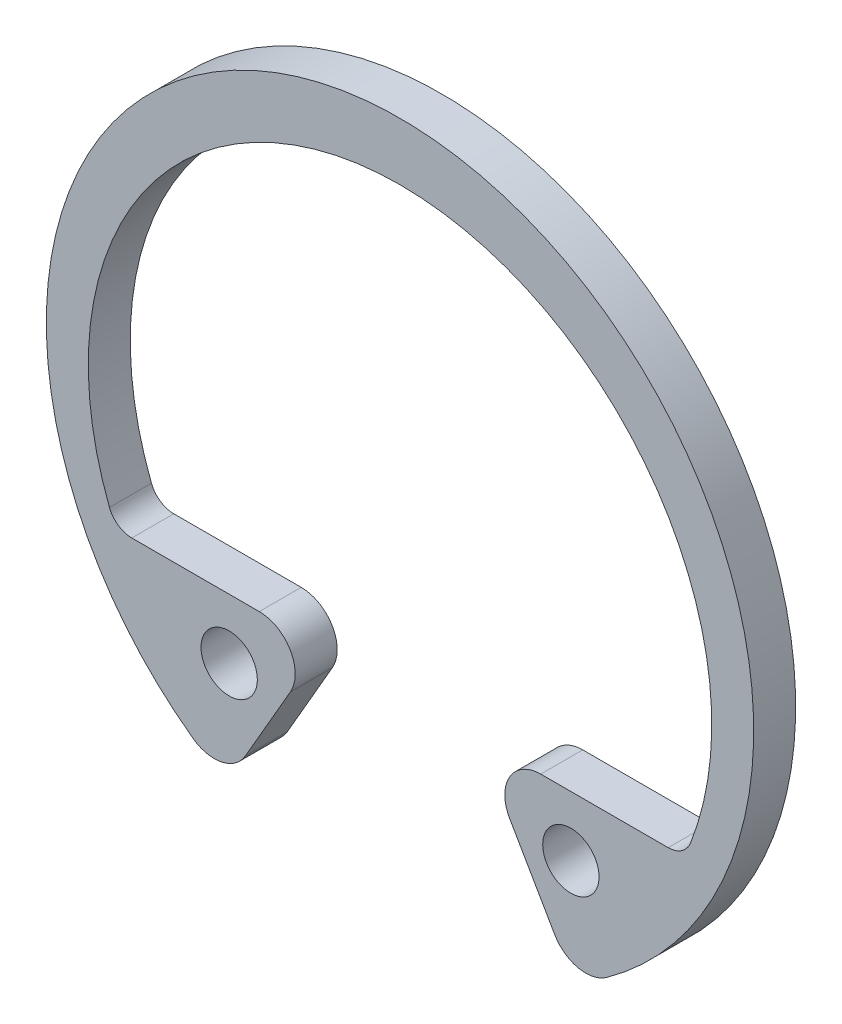
ISO-10303-21;
HEADER;
FILE_DESCRIPTION(('STEP AP214'),'2;1');
FILE_NAME('part.step','',(''),(''),'','','');
FILE_SCHEMA(('AUTOMOTIVE_DESIGN { 1 0 10303 214 1 1 1 1 }'));
ENDSEC;
DATA;
#1=APPLICATION_CONTEXT('core data for automotive mechanical design processes');
#2=APPLICATION_PROTOCOL_DEFINITION('international standard','automotive_design',2000,#1);
#3=PRODUCT_CONTEXT('',#1,'mechanical');
#4=PRODUCT('Part','Part','',(#3));
#5=PRODUCT_RELATED_PRODUCT_CATEGORY('part','',(#4));
#6=PRODUCT_DEFINITION_FORMATION('','',#4);
#7=PRODUCT_DEFINITION_CONTEXT('part definition',#1,'design');
#8=PRODUCT_DEFINITION('design','',#6,#7);
#9=PRODUCT_DEFINITION_SHAPE('','',#8);
#10=(LENGTH_UNIT() NAMED_UNIT(*) SI_UNIT(.MILLI.,.METRE.));
#11=(NAMED_UNIT(*) PLANE_ANGLE_UNIT() SI_UNIT($,.RADIAN.));
#12=(NAMED_UNIT(*) SI_UNIT($,.STERADIAN.) SOLID_ANGLE_UNIT());
#13=UNCERTAINTY_MEASURE_WITH_UNIT(LENGTH_MEASURE(1.E-05),#10,'distance_accuracy_value','');
#14=(GEOMETRIC_REPRESENTATION_CONTEXT(3) GLOBAL_UNCERTAINTY_ASSIGNED_CONTEXT((#13)) GLOBAL_UNIT_ASSIGNED_CONTEXT((#10,
#11,#12)) REPRESENTATION_CONTEXT('',''));
#15=CARTESIAN_POINT('',(0.,0.,0.));
#16=DIRECTION('',(0.,0.,1.));
#17=DIRECTION('',(1.,0.,0.));
#18=AXIS2_PLACEMENT_3D('',#15,#16,#17);
#19=CARTESIAN_POINT('',(3.93495107974673,-5.46099999999999,0.889000000000001));
#20=DIRECTION('',(0.,0.,1.));
#21=DIRECTION('',(1.,0.,0.));
#22=AXIS2_PLACEMENT_3D('',#19,#20,#21);
#23=PLANE('',#22);
#24=CARTESIAN_POINT('',(-3.61950000000001,-4.31799999999999,0.888999999999973));
#25=DIRECTION('',(0.,0.,1.));
#26=DIRECTION('',(1.,0.,0.));
#27=AXIS2_PLACEMENT_3D('',#24,#25,#26);
#28=CIRCLE('',#27,0.5969);
#29=CARTESIAN_POINT('',(-3.02260000000001,-4.31799999999999,0.888999999999973));
#30=VERTEX_POINT('',#29);
#31=EDGE_CURVE('E169',#30,#30,#28,.T.);
#32=ORIENTED_EDGE('',*,*,#31,.F.);
#33=EDGE_LOOP('',(#32));
#34=FACE_BOUND('',#33,.T.);
#35=CARTESIAN_POINT('',(3.93495107974673,-5.46099999999999,0.889000000000001));
#36=DIRECTION('',(0.,0.,1.));
#37=DIRECTION('',(1.,0.,0.));
#38=AXIS2_PLACEMENT_3D('',#35,#36,#37);
#39=CIRCLE('',#38,0.762);
#40=CARTESIAN_POINT('',(3.27503972206297,-5.84199999999999,0.889000000000001));
#41=VERTEX_POINT('',#40);
#42=CARTESIAN_POINT('',(4.38041723971805,-6.07922641509434,0.889000000000001));
#43=VERTEX_POINT('',#42);
#44=EDGE_CURVE('E188',#41,#43,#39,.T.);
#45=ORIENTED_EDGE('',*,*,#44,.T.);
#46=CARTESIAN_POINT('',(0.,0.,0.889000000000001));
#47=DIRECTION('',(0.,0.,1.));
#48=DIRECTION('',(1.,0.,0.));
#49=AXIS2_PLACEMENT_3D('',#46,#47,#48);
#50=CIRCLE('',#49,7.493);
#51=CARTESIAN_POINT('',(-4.38041723971809,-6.07922641509434,0.889000000000001));
#52=VERTEX_POINT('',#51);
#53=EDGE_CURVE('E116',#43,#52,#50,.T.);
#54=ORIENTED_EDGE('',*,*,#53,.T.);
#55=CARTESIAN_POINT('',(-3.93495107974674,-5.46099999999999,0.888999999999973));
#56=DIRECTION('',(0.,0.,1.));
#57=DIRECTION('',(-1.,0.,0.));
#58=AXIS2_PLACEMENT_3D('',#55,#56,#57);
#59=CIRCLE('',#58,0.762);
#60=CARTESIAN_POINT('',(-3.27503972206301,-5.84199999999999,0.889000000000001));
#61=VERTEX_POINT('',#60);
#62=EDGE_CURVE('E215',#52,#61,#59,.T.);
#63=ORIENTED_EDGE('',*,*,#62,.T.);
#64=DIRECTION('',(0.500000000000001,0.866025403784438,0.));
#65=VECTOR('',#64,1.);
#66=CARTESIAN_POINT('',(-2.32183442763094,-4.191,0.889000000000001));
#67=LINE('',#66,#65);
#68=CARTESIAN_POINT('',(-2.32183442763094,-4.191,0.889000000000001));
#69=VERTEX_POINT('',#68);
#70=EDGE_CURVE('E234',#61,#69,#67,.T.);
#71=ORIENTED_EDGE('',*,*,#70,.T.);
#72=CARTESIAN_POINT('',(-2.98174578531464,-3.80999999999998,0.889000000000001));
#73=DIRECTION('',(0.,0.,1.));
#74=DIRECTION('',(-1.,0.,0.));
#75=AXIS2_PLACEMENT_3D('',#72,#73,#74);
#76=CIRCLE('',#75,0.762);
#77=CARTESIAN_POINT('',(-2.98174578531465,-3.048,0.888999999999973));
#78=VERTEX_POINT('',#77);
#79=EDGE_CURVE('E231',#69,#78,#76,.T.);
#80=ORIENTED_EDGE('',*,*,#79,.T.);
#81=DIRECTION('',(-1.,0.,0.));
#82=VECTOR('',#81,1.);
#83=CARTESIAN_POINT('',(-5.68137306995417,-3.04799999999997,0.888999999999973));
#84=LINE('',#83,#82);
#85=CARTESIAN_POINT('',(-5.68137306995417,-3.04799999999997,0.888999999999973));
#86=VERTEX_POINT('',#85);
#87=EDGE_CURVE('E233',#78,#86,#84,.T.);
#88=ORIENTED_EDGE('',*,*,#87,.T.);
#89=CARTESIAN_POINT('',(-5.68137306995414,-2.53999999999999,0.888999999999973));
#90=DIRECTION('',(0.,0.,-1.));
#91=DIRECTION('',(-1.,0.,0.));
#92=AXIS2_PLACEMENT_3D('',#89,#90,#91);
#93=CIRCLE('',#92,0.507999999999999);
#94=CARTESIAN_POINT('',(-6.15482082578364,-2.72415000000001,0.889000000000001));
#95=VERTEX_POINT('',#94);
#96=EDGE_CURVE('E236',#86,#95,#93,.T.);
#97=ORIENTED_EDGE('',*,*,#96,.T.);
#98=CARTESIAN_POINT('',(0.,-0.330200000000003,0.889000000000001));
#99=DIRECTION('',(0.,0.,-1.));
#100=DIRECTION('',(1.,0.,0.));
#101=AXIS2_PLACEMENT_3D('',#98,#99,#100);
#102=CIRCLE('',#101,6.604);
#103=CARTESIAN_POINT('',(6.15482082578363,-2.72415000000001,0.889000000000001));
#104=VERTEX_POINT('',#103);
#105=EDGE_CURVE('E242',#95,#104,#102,.T.);
#106=ORIENTED_EDGE('',*,*,#105,.T.);
#107=CARTESIAN_POINT('',(5.68137306995413,-2.53999999999999,0.888999999999945));
#108=DIRECTION('',(0.,0.,-1.));
#109=DIRECTION('',(1.,0.,0.));
#110=AXIS2_PLACEMENT_3D('',#107,#108,#109);
#111=CIRCLE('',#110,0.507999999999999);
#112=CARTESIAN_POINT('',(5.68137306995412,-3.04800000000002,0.888999999999973));
#113=VERTEX_POINT('',#112);
#114=EDGE_CURVE('E147',#104,#113,#111,.T.);
#115=ORIENTED_EDGE('',*,*,#114,.T.);
#116=DIRECTION('',(-1.,0.,0.));
#117=VECTOR('',#116,1.);
#118=CARTESIAN_POINT('',(5.68137306995412,-3.04800000000002,0.888999999999973));
#119=LINE('',#118,#117);
#120=CARTESIAN_POINT('',(2.98174578531467,-3.048,0.889000000000001));
#121=VERTEX_POINT('',#120);
#122=EDGE_CURVE('E141',#113,#121,#119,.T.);
#123=ORIENTED_EDGE('',*,*,#122,.T.);
#124=CARTESIAN_POINT('',(2.98174578531465,-3.80999999999998,0.889000000000001));
#125=DIRECTION('',(0.,0.,1.));
#126=DIRECTION('',(-1.,0.,0.));
#127=AXIS2_PLACEMENT_3D('',#124,#125,#126);
#128=CIRCLE('',#127,0.762);
#129=CARTESIAN_POINT('',(2.32183442763091,-4.19099999999997,0.889000000000001));
#130=VERTEX_POINT('',#129);
#131=EDGE_CURVE('E145',#121,#130,#128,.T.);
#132=ORIENTED_EDGE('',*,*,#131,.T.);
#133=DIRECTION('',(0.500000000000001,-0.866025403784438,0.));
#134=VECTOR('',#133,1.);
#135=CARTESIAN_POINT('',(2.32183442763091,-4.19099999999997,0.889000000000001));
#136=LINE('',#135,#134);
#137=EDGE_CURVE('E61',#130,#41,#136,.T.);
#138=ORIENTED_EDGE('',*,*,#137,.T.);
#139=EDGE_LOOP('',(#45,#54,#63,#71,#80,#88,#97,#106,#115,#123,#132,#138));
#140=FACE_BOUND('',#139,.T.);
#141=CARTESIAN_POINT('',(3.61949999999998,-4.31799999999996,0.889000000000001));
#142=DIRECTION('',(0.,0.,1.));
#143=DIRECTION('',(-1.,0.,0.));
#144=AXIS2_PLACEMENT_3D('',#141,#142,#143);
#145=CIRCLE('',#144,0.5969);
#146=CARTESIAN_POINT('',(3.02259999999998,-4.31799999999996,0.889000000000001));
#147=VERTEX_POINT('',#146);
#148=EDGE_CURVE('E285',#147,#147,#145,.T.);
#149=ORIENTED_EDGE('',*,*,#148,.F.);
#150=EDGE_LOOP('',(#149));
#151=FACE_BOUND('',#150,.T.);
#152=ADVANCED_FACE('F44',(#34,#140,#151),#23,.T.);
#153=CARTESIAN_POINT('',(3.93495107974672,-5.46099999999999,0.));
#154=DIRECTION('',(0.,0.,1.));
#155=DIRECTION('',(1.,0.,0.));
#156=AXIS2_PLACEMENT_3D('',#153,#154,#155);
#157=PLANE('',#156);
#158=CARTESIAN_POINT('',(-3.6195,-4.31799999999999,0.));
#159=DIRECTION('',(0.,0.,1.));
#160=DIRECTION('',(1.,0.,0.));
#161=AXIS2_PLACEMENT_3D('',#158,#159,#160);
#162=CIRCLE('',#161,0.5969);
#163=CARTESIAN_POINT('',(-3.0226,-4.31799999999999,0.));
#164=VERTEX_POINT('',#163);
#165=EDGE_CURVE('E290',#164,#164,#162,.T.);
#166=ORIENTED_EDGE('',*,*,#165,.T.);
#167=EDGE_LOOP('',(#166));
#168=FACE_BOUND('',#167,.T.);
#169=CARTESIAN_POINT('',(3.93495107974672,-5.46099999999999,0.));
#170=DIRECTION('',(0.,0.,1.));
#171=DIRECTION('',(1.,0.,0.));
#172=AXIS2_PLACEMENT_3D('',#169,#170,#171);
#173=CIRCLE('',#172,0.762);
#174=CARTESIAN_POINT('',(3.27503972206299,-5.84199999999999,0.));
#175=VERTEX_POINT('',#174);
#176=CARTESIAN_POINT('',(4.38041723971806,-6.07922641509434,0.));
#177=VERTEX_POINT('',#176);
#178=EDGE_CURVE('E165',#175,#177,#173,.T.);
#179=ORIENTED_EDGE('',*,*,#178,.F.);
#180=DIRECTION('',(0.500000000000001,-0.866025403784438,0.));
#181=VECTOR('',#180,1.);
#182=CARTESIAN_POINT('',(2.32183442763093,-4.19099999999994,0.));
#183=LINE('',#182,#181);
#184=CARTESIAN_POINT('',(2.32183442763093,-4.19099999999994,0.));
#185=VERTEX_POINT('',#184);
#186=EDGE_CURVE('E108',#185,#175,#183,.T.);
#187=ORIENTED_EDGE('',*,*,#186,.F.);
#188=CARTESIAN_POINT('',(2.98174578531464,-3.80999999999998,0.));
#189=DIRECTION('',(0.,0.,1.));
#190=DIRECTION('',(-1.,0.,0.));
#191=AXIS2_PLACEMENT_3D('',#188,#189,#190);
#192=CIRCLE('',#191,0.762);
#193=CARTESIAN_POINT('',(2.98174578531467,-3.048,0.));
#194=VERTEX_POINT('',#193);
#195=EDGE_CURVE('E102',#194,#185,#192,.T.);
#196=ORIENTED_EDGE('',*,*,#195,.F.);
#197=DIRECTION('',(-1.,0.,0.));
#198=VECTOR('',#197,1.);
#199=CARTESIAN_POINT('',(5.68137306995412,-3.04800000000002,0.));
#200=LINE('',#199,#198);
#201=CARTESIAN_POINT('',(5.68137306995412,-3.04800000000002,0.));
#202=VERTEX_POINT('',#201);
#203=EDGE_CURVE('E155',#202,#194,#200,.T.);
#204=ORIENTED_EDGE('',*,*,#203,.F.);
#205=CARTESIAN_POINT('',(5.68137306995413,-2.53999999999999,0.));
#206=DIRECTION('',(0.,0.,-1.));
#207=DIRECTION('',(1.,0.,0.));
#208=AXIS2_PLACEMENT_3D('',#205,#206,#207);
#209=CIRCLE('',#208,0.507999999999999);
#210=CARTESIAN_POINT('',(6.15482082578361,-2.72415000000001,0.));
#211=VERTEX_POINT('',#210);
#212=EDGE_CURVE('E183',#211,#202,#209,.T.);
#213=ORIENTED_EDGE('',*,*,#212,.F.);
#214=CARTESIAN_POINT('',(0.,-0.330200000000003,0.));
#215=DIRECTION('',(0.,0.,-1.));
#216=DIRECTION('',(1.,0.,0.));
#217=AXIS2_PLACEMENT_3D('',#214,#215,#216);
#218=CIRCLE('',#217,6.604);
#219=CARTESIAN_POINT('',(-6.15482082578363,-2.72415000000001,0.));
#220=VERTEX_POINT('',#219);
#221=EDGE_CURVE('E181',#220,#211,#218,.T.);
#222=ORIENTED_EDGE('',*,*,#221,.F.);
#223=CARTESIAN_POINT('',(-5.68137306995417,-2.53999999999999,0.));
#224=DIRECTION('',(0.,0.,-1.));
#225=DIRECTION('',(-1.,0.,0.));
#226=AXIS2_PLACEMENT_3D('',#223,#224,#225);
#227=CIRCLE('',#226,0.507999999999999);
#228=CARTESIAN_POINT('',(-5.68137306995417,-3.04799999999997,0.));
#229=VERTEX_POINT('',#228);
#230=EDGE_CURVE('E179',#229,#220,#227,.T.);
#231=ORIENTED_EDGE('',*,*,#230,.F.);
#232=DIRECTION('',(-1.,0.,0.));
#233=VECTOR('',#232,1.);
#234=CARTESIAN_POINT('',(-5.68137306995417,-3.04799999999997,0.));
#235=LINE('',#234,#233);
#236=CARTESIAN_POINT('',(-2.98174578531468,-3.048,0.));
#237=VERTEX_POINT('',#236);
#238=EDGE_CURVE('E177',#237,#229,#235,.T.);
#239=ORIENTED_EDGE('',*,*,#238,.F.);
#240=CARTESIAN_POINT('',(-2.98174578531468,-3.81000000000001,0.));
#241=DIRECTION('',(0.,0.,1.));
#242=DIRECTION('',(-1.,0.,0.));
#243=AXIS2_PLACEMENT_3D('',#240,#241,#242);
#244=CIRCLE('',#243,0.762);
#245=CARTESIAN_POINT('',(-2.32183442763091,-4.19099999999997,0.));
#246=VERTEX_POINT('',#245);
#247=EDGE_CURVE('E175',#246,#237,#244,.T.);
#248=ORIENTED_EDGE('',*,*,#247,.F.);
#249=DIRECTION('',(0.500000000000001,0.866025403784438,0.));
#250=VECTOR('',#249,1.);
#251=CARTESIAN_POINT('',(-2.32183442763091,-4.19099999999997,0.));
#252=LINE('',#251,#250);
#253=CARTESIAN_POINT('',(-3.275039722063,-5.84200000000001,0.));
#254=VERTEX_POINT('',#253);
#255=EDGE_CURVE('E173',#254,#246,#252,.T.);
#256=ORIENTED_EDGE('',*,*,#255,.F.);
#257=CARTESIAN_POINT('',(-3.93495107974676,-5.46099999999999,0.));
#258=DIRECTION('',(0.,0.,1.));
#259=DIRECTION('',(-1.,0.,0.));
#260=AXIS2_PLACEMENT_3D('',#257,#258,#259);
#261=CIRCLE('',#260,0.762);
#262=CARTESIAN_POINT('',(-4.38041723971808,-6.07922641509434,0.));
#263=VERTEX_POINT('',#262);
#264=EDGE_CURVE('E171',#263,#254,#261,.T.);
#265=ORIENTED_EDGE('',*,*,#264,.F.);
#266=CARTESIAN_POINT('',(0.,0.,0.));
#267=DIRECTION('',(0.,0.,1.));
#268=DIRECTION('',(1.,0.,0.));
#269=AXIS2_PLACEMENT_3D('',#266,#267,#268);
#270=CIRCLE('',#269,7.493);
#271=EDGE_CURVE('E168',#177,#263,#270,.T.);
#272=ORIENTED_EDGE('',*,*,#271,.F.);
#273=EDGE_LOOP('',(#179,#187,#196,#204,#213,#222,#231,#239,#248,#256,#265,#272));
#274=FACE_BOUND('',#273,.T.);
#275=CARTESIAN_POINT('',(3.61949999999998,-4.31799999999999,0.));
#276=DIRECTION('',(0.,0.,1.));
#277=DIRECTION('',(-1.,0.,0.));
#278=AXIS2_PLACEMENT_3D('',#275,#276,#277);
#279=CIRCLE('',#278,0.5969);
#280=CARTESIAN_POINT('',(3.02259999999998,-4.31799999999999,0.));
#281=VERTEX_POINT('',#280);
#282=EDGE_CURVE('E288',#281,#281,#279,.T.);
#283=ORIENTED_EDGE('',*,*,#282,.T.);
#284=EDGE_LOOP('',(#283));
#285=FACE_BOUND('',#284,.T.);
#286=ADVANCED_FACE('F219',(#168,#274,#285),#157,.F.);
#287=CARTESIAN_POINT('',(3.93495107974673,-5.46099999999999,0.889000000000001));
#288=DIRECTION('',(0.,0.,-1.));
#289=DIRECTION('',(-1.,0.,0.));
#290=AXIS2_PLACEMENT_3D('',#287,#288,#289);
#291=CYLINDRICAL_SURFACE('',#290,0.762);
#292=ORIENTED_EDGE('',*,*,#178,.T.);
#293=DIRECTION('',(0.,0.,-1.));
#294=VECTOR('',#293,1.);
#295=CARTESIAN_POINT('',(4.38041723971805,-6.07922641509434,0.889000000000001));
#296=LINE('',#295,#294);
#297=EDGE_CURVE('E12',#43,#177,#296,.T.);
#298=ORIENTED_EDGE('',*,*,#297,.F.);
#299=ORIENTED_EDGE('',*,*,#44,.F.);
#300=DIRECTION('',(0.,0.,-1.));
#301=VECTOR('',#300,1.);
#302=CARTESIAN_POINT('',(3.27503972206297,-5.84199999999999,0.889000000000001));
#303=LINE('',#302,#301);
#304=EDGE_CURVE('E161',#41,#175,#303,.T.);
#305=ORIENTED_EDGE('',*,*,#304,.T.);
#306=EDGE_LOOP('',(#292,#298,#299,#305));
#307=FACE_BOUND('',#306,.T.);
#308=ADVANCED_FACE('F46',(#307),#291,.T.);
#309=CARTESIAN_POINT('',(0.,0.,0.889000000000001));
#310=DIRECTION('',(0.,0.,-1.));
#311=DIRECTION('',(-1.,0.,0.));
#312=AXIS2_PLACEMENT_3D('',#309,#310,#311);
#313=CYLINDRICAL_SURFACE('',#312,7.493);
#314=ORIENTED_EDGE('',*,*,#271,.T.);
#315=DIRECTION('',(0.,0.,-1.));
#316=VECTOR('',#315,1.);
#317=CARTESIAN_POINT('',(-4.38041723971809,-6.07922641509434,0.889000000000001));
#318=LINE('',#317,#316);
#319=EDGE_CURVE('E53',#52,#263,#318,.T.);
#320=ORIENTED_EDGE('',*,*,#319,.F.);
#321=ORIENTED_EDGE('',*,*,#53,.F.);
#322=ORIENTED_EDGE('',*,*,#297,.T.);
#323=EDGE_LOOP('',(#314,#320,#321,#322));
#324=FACE_BOUND('',#323,.T.);
#325=ADVANCED_FACE('F383',(#324),#313,.T.);
#326=CARTESIAN_POINT('',(-3.93495107974674,-5.46099999999999,0.888999999999973));
#327=DIRECTION('',(0.,0.,-1.));
#328=DIRECTION('',(-1.,0.,0.));
#329=AXIS2_PLACEMENT_3D('',#326,#327,#328);
#330=CYLINDRICAL_SURFACE('',#329,0.762);
#331=ORIENTED_EDGE('',*,*,#264,.T.);
#332=DIRECTION('',(0.,0.,-1.));
#333=VECTOR('',#332,1.);
#334=CARTESIAN_POINT('',(-3.27503972206301,-5.84199999999999,0.889000000000001));
#335=LINE('',#334,#333);
#336=EDGE_CURVE('E207',#61,#254,#335,.T.);
#337=ORIENTED_EDGE('',*,*,#336,.F.);
#338=ORIENTED_EDGE('',*,*,#62,.F.);
#339=ORIENTED_EDGE('',*,*,#319,.T.);
#340=EDGE_LOOP('',(#331,#337,#338,#339));
#341=FACE_BOUND('',#340,.T.);
#342=ADVANCED_FACE('F213',(#341),#330,.T.);
#343=CARTESIAN_POINT('',(-2.32183442763094,-4.191,0.889000000000001));
#344=DIRECTION('',(-0.866025403784438,0.500000000000001,0.));
#345=DIRECTION('',(-0.500000000000001,-0.866025403784438,0.));
#346=AXIS2_PLACEMENT_3D('',#343,#344,#345);
#347=PLANE('',#346);
#348=ORIENTED_EDGE('',*,*,#255,.T.);
#349=DIRECTION('',(0.,0.,-1.));
#350=VECTOR('',#349,1.);
#351=CARTESIAN_POINT('',(-2.32183442763094,-4.191,0.889000000000001));
#352=LINE('',#351,#350);
#353=EDGE_CURVE('E204',#69,#246,#352,.T.);
#354=ORIENTED_EDGE('',*,*,#353,.F.);
#355=ORIENTED_EDGE('',*,*,#70,.F.);
#356=ORIENTED_EDGE('',*,*,#336,.T.);
#357=EDGE_LOOP('',(#348,#354,#355,#356));
#358=FACE_BOUND('',#357,.T.);
#359=ADVANCED_FACE('F225',(#358),#347,.F.);
#360=CARTESIAN_POINT('',(-2.98174578531464,-3.80999999999998,0.889000000000001));
#361=DIRECTION('',(0.,0.,-1.));
#362=DIRECTION('',(-1.,0.,0.));
#363=AXIS2_PLACEMENT_3D('',#360,#361,#362);
#364=CYLINDRICAL_SURFACE('',#363,0.762);
#365=ORIENTED_EDGE('',*,*,#247,.T.);
#366=DIRECTION('',(0.,0.,-1.));
#367=VECTOR('',#366,1.);
#368=CARTESIAN_POINT('',(-2.98174578531465,-3.048,0.888999999999973));
#369=LINE('',#368,#367);
#370=EDGE_CURVE('E201',#78,#237,#369,.T.);
#371=ORIENTED_EDGE('',*,*,#370,.F.);
#372=ORIENTED_EDGE('',*,*,#79,.F.);
#373=ORIENTED_EDGE('',*,*,#353,.T.);
#374=EDGE_LOOP('',(#365,#371,#372,#373));
#375=FACE_BOUND('',#374,.T.);
#376=ADVANCED_FACE('F229',(#375),#364,.T.);
#377=CARTESIAN_POINT('',(-5.68137306995417,-3.04799999999997,0.888999999999973));
#378=DIRECTION('',(0.,-1.,0.));
#379=DIRECTION('',(0.,0.,-1.));
#380=AXIS2_PLACEMENT_3D('',#377,#378,#379);
#381=PLANE('',#380);
#382=ORIENTED_EDGE('',*,*,#238,.T.);
#383=DIRECTION('',(0.,0.,-1.));
#384=VECTOR('',#383,1.);
#385=CARTESIAN_POINT('',(-5.68137306995417,-3.04799999999997,0.888999999999973));
#386=LINE('',#385,#384);
#387=EDGE_CURVE('E198',#86,#229,#386,.T.);
#388=ORIENTED_EDGE('',*,*,#387,.F.);
#389=ORIENTED_EDGE('',*,*,#87,.F.);
#390=ORIENTED_EDGE('',*,*,#370,.T.);
#391=EDGE_LOOP('',(#382,#388,#389,#390));
#392=FACE_BOUND('',#391,.T.);
#393=ADVANCED_FACE('F348',(#392),#381,.F.);
#394=CARTESIAN_POINT('',(-5.68137306995414,-2.53999999999999,0.888999999999973));
#395=DIRECTION('',(0.,0.,-1.));
#396=DIRECTION('',(-1.,0.,0.));
#397=AXIS2_PLACEMENT_3D('',#394,#395,#396);
#398=CYLINDRICAL_SURFACE('',#397,0.507999999999999);
#399=ORIENTED_EDGE('',*,*,#230,.T.);
#400=DIRECTION('',(0.,0.,-1.));
#401=VECTOR('',#400,1.);
#402=CARTESIAN_POINT('',(-6.15482082578364,-2.72415000000001,0.889000000000001));
#403=LINE('',#402,#401);
#404=EDGE_CURVE('E195',#95,#220,#403,.T.);
#405=ORIENTED_EDGE('',*,*,#404,.F.);
#406=ORIENTED_EDGE('',*,*,#96,.F.);
#407=ORIENTED_EDGE('',*,*,#387,.T.);
#408=EDGE_LOOP('',(#399,#405,#406,#407));
#409=FACE_BOUND('',#408,.T.);
#410=ADVANCED_FACE('F339',(#409),#398,.F.);
#411=CARTESIAN_POINT('',(0.,-0.330200000000003,0.889000000000001));
#412=DIRECTION('',(0.,0.,-1.));
#413=DIRECTION('',(-1.,0.,0.));
#414=AXIS2_PLACEMENT_3D('',#411,#412,#413);
#415=CYLINDRICAL_SURFACE('',#414,6.604);
#416=ORIENTED_EDGE('',*,*,#221,.T.);
#417=DIRECTION('',(0.,0.,-1.));
#418=VECTOR('',#417,1.);
#419=CARTESIAN_POINT('',(6.15482082578363,-2.72415000000001,0.889000000000001));
#420=LINE('',#419,#418);
#421=EDGE_CURVE('E192',#104,#211,#420,.T.);
#422=ORIENTED_EDGE('',*,*,#421,.F.);
#423=ORIENTED_EDGE('',*,*,#105,.F.);
#424=ORIENTED_EDGE('',*,*,#404,.T.);
#425=EDGE_LOOP('',(#416,#422,#423,#424));
#426=FACE_BOUND('',#425,.T.);
#427=ADVANCED_FACE('F248',(#426),#415,.F.);
#428=CARTESIAN_POINT('',(5.68137306995413,-2.53999999999999,0.888999999999945));
#429=DIRECTION('',(0.,0.,-1.));
#430=DIRECTION('',(-1.,0.,0.));
#431=AXIS2_PLACEMENT_3D('',#428,#429,#430);
#432=CYLINDRICAL_SURFACE('',#431,0.507999999999999);
#433=ORIENTED_EDGE('',*,*,#212,.T.);
#434=DIRECTION('',(0.,0.,-1.));
#435=VECTOR('',#434,1.);
#436=CARTESIAN_POINT('',(5.68137306995412,-3.04800000000002,0.888999999999973));
#437=LINE('',#436,#435);
#438=EDGE_CURVE('E156',#113,#202,#437,.T.);
#439=ORIENTED_EDGE('',*,*,#438,.F.);
#440=ORIENTED_EDGE('',*,*,#114,.F.);
#441=ORIENTED_EDGE('',*,*,#421,.T.);
#442=EDGE_LOOP('',(#433,#439,#440,#441));
#443=FACE_BOUND('',#442,.T.);
#444=ADVANCED_FACE('F252',(#443),#432,.F.);
#445=CARTESIAN_POINT('',(5.68137306995412,-3.04800000000002,0.888999999999973));
#446=DIRECTION('',(0.,-1.,0.));
#447=DIRECTION('',(1.,0.,0.));
#448=AXIS2_PLACEMENT_3D('',#445,#446,#447);
#449=PLANE('',#448);
#450=ORIENTED_EDGE('',*,*,#203,.T.);
#451=DIRECTION('',(0.,0.,-1.));
#452=VECTOR('',#451,1.);
#453=CARTESIAN_POINT('',(2.98174578531467,-3.048,0.889000000000001));
#454=LINE('',#453,#452);
#455=EDGE_CURVE('E152',#121,#194,#454,.T.);
#456=ORIENTED_EDGE('',*,*,#455,.F.);
#457=ORIENTED_EDGE('',*,*,#122,.F.);
#458=ORIENTED_EDGE('',*,*,#438,.T.);
#459=EDGE_LOOP('',(#450,#456,#457,#458));
#460=FACE_BOUND('',#459,.T.);
#461=ADVANCED_FACE('F153',(#460),#449,.F.);
#462=CARTESIAN_POINT('',(2.98174578531465,-3.80999999999998,0.889000000000001));
#463=DIRECTION('',(0.,0.,-1.));
#464=DIRECTION('',(-1.,0.,0.));
#465=AXIS2_PLACEMENT_3D('',#462,#463,#464);
#466=CYLINDRICAL_SURFACE('',#465,0.762);
#467=ORIENTED_EDGE('',*,*,#195,.T.);
#468=DIRECTION('',(0.,0.,-1.));
#469=VECTOR('',#468,1.);
#470=CARTESIAN_POINT('',(2.32183442763091,-4.19099999999997,0.889000000000001));
#471=LINE('',#470,#469);
#472=EDGE_CURVE('E157',#130,#185,#471,.T.);
#473=ORIENTED_EDGE('',*,*,#472,.F.);
#474=ORIENTED_EDGE('',*,*,#131,.F.);
#475=ORIENTED_EDGE('',*,*,#455,.T.);
#476=EDGE_LOOP('',(#467,#473,#474,#475));
#477=FACE_BOUND('',#476,.T.);
#478=ADVANCED_FACE('F159',(#477),#466,.T.);
#479=CARTESIAN_POINT('',(2.32183442763091,-4.19099999999997,0.889000000000001));
#480=DIRECTION('',(0.866025403784438,0.500000000000001,0.));
#481=DIRECTION('',(-0.500000000000001,0.866025403784438,0.));
#482=AXIS2_PLACEMENT_3D('',#479,#480,#481);
#483=PLANE('',#482);
#484=ORIENTED_EDGE('',*,*,#186,.T.);
#485=ORIENTED_EDGE('',*,*,#304,.F.);
#486=ORIENTED_EDGE('',*,*,#137,.F.);
#487=ORIENTED_EDGE('',*,*,#472,.T.);
#488=EDGE_LOOP('',(#484,#485,#486,#487));
#489=FACE_BOUND('',#488,.T.);
#490=ADVANCED_FACE('F256',(#489),#483,.F.);
#491=CARTESIAN_POINT('',(-3.61950000000001,-4.31799999999999,0.888999999999973));
#492=DIRECTION('',(0.,0.,-1.));
#493=DIRECTION('',(-1.,0.,0.));
#494=AXIS2_PLACEMENT_3D('',#491,#492,#493);
#495=CYLINDRICAL_SURFACE('',#494,0.5969);
#496=ORIENTED_EDGE('',*,*,#31,.T.);
#497=EDGE_LOOP('',(#496));
#498=FACE_BOUND('',#497,.T.);
#499=ORIENTED_EDGE('',*,*,#165,.F.);
#500=EDGE_LOOP('',(#499));
#501=FACE_BOUND('',#500,.T.);
#502=ADVANCED_FACE('F258',(#498,#501),#495,.F.);
#503=CARTESIAN_POINT('',(3.61949999999998,-4.31799999999996,0.889000000000001));
#504=DIRECTION('',(0.,0.,-1.));
#505=DIRECTION('',(-1.,0.,0.));
#506=AXIS2_PLACEMENT_3D('',#503,#504,#505);
#507=CYLINDRICAL_SURFACE('',#506,0.5969);
#508=ORIENTED_EDGE('',*,*,#148,.T.);
#509=EDGE_LOOP('',(#508));
#510=FACE_BOUND('',#509,.T.);
#511=ORIENTED_EDGE('',*,*,#282,.F.);
#512=EDGE_LOOP('',(#511));
#513=FACE_BOUND('',#512,.T.);
#514=ADVANCED_FACE('F264',(#510,#513),#507,.F.);
#515=CLOSED_SHELL('',(#152,#286,#308,#325,#342,#359,#376,#393,#410,#427,#444,#461,#478,#490,
#502,#514));
#516=MANIFOLD_SOLID_BREP('B2',#515);
#517=ADVANCED_BREP_SHAPE_REPRESENTATION('',(#18,#516),#14);
#518=SHAPE_DEFINITION_REPRESENTATION(#9,#517);
ENDSEC;
END-ISO-10303-21;
